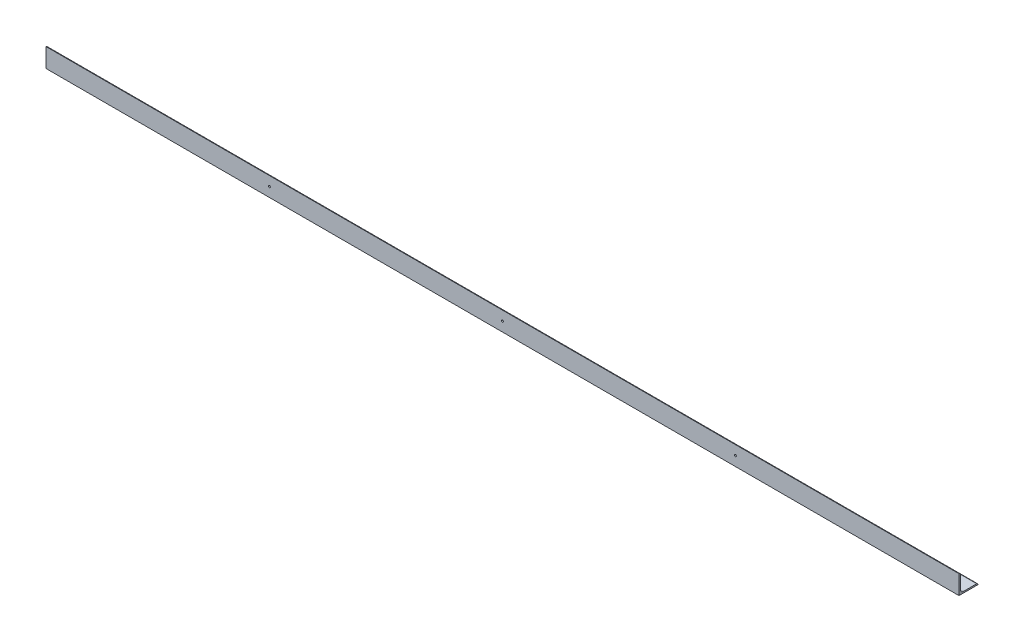
ISO-10303-21;
HEADER;
FILE_DESCRIPTION(('STEP AP214'),'2;1');
FILE_NAME('part.step','',(''),(''),'','','');
FILE_SCHEMA(('AUTOMOTIVE_DESIGN { 1 0 10303 214 1 1 1 1 }'));
ENDSEC;
DATA;
#1=APPLICATION_CONTEXT('core data for automotive mechanical design processes');
#2=APPLICATION_PROTOCOL_DEFINITION('international standard','automotive_design',2000,#1);
#3=PRODUCT_CONTEXT('',#1,'mechanical');
#4=PRODUCT('Part','Part','',(#3));
#5=PRODUCT_RELATED_PRODUCT_CATEGORY('part','',(#4));
#6=PRODUCT_DEFINITION_FORMATION('','',#4);
#7=PRODUCT_DEFINITION_CONTEXT('part definition',#1,'design');
#8=PRODUCT_DEFINITION('design','',#6,#7);
#9=PRODUCT_DEFINITION_SHAPE('','',#8);
#10=(LENGTH_UNIT() NAMED_UNIT(*) SI_UNIT(.MILLI.,.METRE.));
#11=(NAMED_UNIT(*) PLANE_ANGLE_UNIT() SI_UNIT($,.RADIAN.));
#12=(NAMED_UNIT(*) SI_UNIT($,.STERADIAN.) SOLID_ANGLE_UNIT());
#13=UNCERTAINTY_MEASURE_WITH_UNIT(LENGTH_MEASURE(1.E-05),#10,'distance_accuracy_value','');
#14=(GEOMETRIC_REPRESENTATION_CONTEXT(3) GLOBAL_UNCERTAINTY_ASSIGNED_CONTEXT((#13)) GLOBAL_UNIT_ASSIGNED_CONTEXT((#10,
#11,#12)) REPRESENTATION_CONTEXT('',''));
#15=CARTESIAN_POINT('',(0.,0.,0.));
#16=DIRECTION('',(0.,0.,1.));
#17=DIRECTION('',(1.,0.,0.));
#18=AXIS2_PLACEMENT_3D('',#15,#16,#17);
#19=CARTESIAN_POINT('',(1920.,0.,-40.));
#20=DIRECTION('',(0.,1.,0.));
#21=DIRECTION('',(0.,0.,1.));
#22=AXIS2_PLACEMENT_3D('',#19,#20,#21);
#23=PLANE('',#22);
#24=CARTESIAN_POINT('',(1450.,0.,-19.9999999999966));
#25=DIRECTION('',(0.,-1.,0.));
#26=DIRECTION('',(0.,0.,-1.));
#27=AXIS2_PLACEMENT_3D('',#24,#25,#26);
#28=CIRCLE('',#27,1.99999999999989);
#29=CARTESIAN_POINT('',(1450.,0.,-21.9999999999965));
#30=VERTEX_POINT('',#29);
#31=EDGE_CURVE('E235',#30,#30,#28,.T.);
#32=ORIENTED_EDGE('',*,*,#31,.F.);
#33=EDGE_LOOP('',(#32));
#34=FACE_BOUND('',#33,.T.);
#35=CARTESIAN_POINT('',(470.,0.,-20.));
#36=DIRECTION('',(0.,-1.,0.));
#37=DIRECTION('',(0.,0.,-1.));
#38=AXIS2_PLACEMENT_3D('',#35,#36,#37);
#39=CIRCLE('',#38,2.);
#40=CARTESIAN_POINT('',(470.,0.,-22.));
#41=VERTEX_POINT('',#40);
#42=EDGE_CURVE('E239',#41,#41,#39,.T.);
#43=ORIENTED_EDGE('',*,*,#42,.F.);
#44=EDGE_LOOP('',(#43));
#45=FACE_BOUND('',#44,.T.);
#46=CARTESIAN_POINT('',(960.,0.,-20.));
#47=DIRECTION('',(0.,-1.,0.));
#48=DIRECTION('',(0.,0.,-1.));
#49=AXIS2_PLACEMENT_3D('',#46,#47,#48);
#50=CIRCLE('',#49,2.);
#51=CARTESIAN_POINT('',(960.,0.,-22.));
#52=VERTEX_POINT('',#51);
#53=EDGE_CURVE('E198',#52,#52,#50,.T.);
#54=ORIENTED_EDGE('',*,*,#53,.F.);
#55=EDGE_LOOP('',(#54));
#56=FACE_BOUND('',#55,.T.);
#57=DIRECTION('',(0.,0.,-1.));
#58=VECTOR('',#57,1.);
#59=CARTESIAN_POINT('',(0.,0.,-40.));
#60=LINE('',#59,#58);
#61=CARTESIAN_POINT('',(0.,0.,0.));
#62=VERTEX_POINT('',#61);
#63=CARTESIAN_POINT('',(0.,0.,-40.));
#64=VERTEX_POINT('',#63);
#65=EDGE_CURVE('E161',#62,#64,#60,.T.);
#66=ORIENTED_EDGE('',*,*,#65,.T.);
#67=DIRECTION('',(-1.,0.,0.));
#68=VECTOR('',#67,1.);
#69=CARTESIAN_POINT('',(1920.,0.,-40.));
#70=LINE('',#69,#68);
#71=CARTESIAN_POINT('',(1920.,0.,-40.));
#72=VERTEX_POINT('',#71);
#73=EDGE_CURVE('E13',#72,#64,#70,.T.);
#74=ORIENTED_EDGE('',*,*,#73,.F.);
#75=DIRECTION('',(0.,0.,-1.));
#76=VECTOR('',#75,1.);
#77=CARTESIAN_POINT('',(1920.,0.,-40.));
#78=LINE('',#77,#76);
#79=CARTESIAN_POINT('',(1920.,0.,0.));
#80=VERTEX_POINT('',#79);
#81=EDGE_CURVE('E180',#80,#72,#78,.T.);
#82=ORIENTED_EDGE('',*,*,#81,.F.);
#83=DIRECTION('',(-1.,0.,0.));
#84=VECTOR('',#83,1.);
#85=CARTESIAN_POINT('',(1920.,0.,0.));
#86=LINE('',#85,#84);
#87=EDGE_CURVE('E157',#80,#62,#86,.T.);
#88=ORIENTED_EDGE('',*,*,#87,.T.);
#89=EDGE_LOOP('',(#66,#74,#82,#88));
#90=FACE_BOUND('',#89,.T.);
#91=ADVANCED_FACE('F64',(#34,#45,#56,#90),#23,.F.);
#92=CARTESIAN_POINT('',(1920.,0.,-37.));
#93=DIRECTION('',(-1.,0.,0.));
#94=DIRECTION('',(0.,0.,1.));
#95=AXIS2_PLACEMENT_3D('',#92,#93,#94);
#96=CYLINDRICAL_SURFACE('',#95,3.);
#97=CARTESIAN_POINT('',(0.,0.,-37.));
#98=DIRECTION('',(1.,0.,0.));
#99=DIRECTION('',(0.,0.,-1.));
#100=AXIS2_PLACEMENT_3D('',#97,#98,#99);
#101=CIRCLE('',#100,3.);
#102=CARTESIAN_POINT('',(0.,3.,-37.));
#103=VERTEX_POINT('',#102);
#104=EDGE_CURVE('E165',#64,#103,#101,.T.);
#105=ORIENTED_EDGE('',*,*,#104,.T.);
#106=DIRECTION('',(-1.,0.,0.));
#107=VECTOR('',#106,1.);
#108=CARTESIAN_POINT('',(1920.,3.,-37.));
#109=LINE('',#108,#107);
#110=CARTESIAN_POINT('',(1920.,3.,-37.));
#111=VERTEX_POINT('',#110);
#112=EDGE_CURVE('E74',#111,#103,#109,.T.);
#113=ORIENTED_EDGE('',*,*,#112,.F.);
#114=CARTESIAN_POINT('',(1920.,0.,-37.));
#115=DIRECTION('',(1.,0.,0.));
#116=DIRECTION('',(0.,0.,-1.));
#117=AXIS2_PLACEMENT_3D('',#114,#115,#116);
#118=CIRCLE('',#117,3.);
#119=EDGE_CURVE('E123',#72,#111,#118,.T.);
#120=ORIENTED_EDGE('',*,*,#119,.F.);
#121=ORIENTED_EDGE('',*,*,#73,.T.);
#122=EDGE_LOOP('',(#105,#113,#120,#121));
#123=FACE_BOUND('',#122,.T.);
#124=ADVANCED_FACE('F228',(#123),#96,.T.);
#125=CARTESIAN_POINT('',(1920.,3.,-9.));
#126=DIRECTION('',(0.,-1.,0.));
#127=DIRECTION('',(0.,0.,-1.));
#128=AXIS2_PLACEMENT_3D('',#125,#126,#127);
#129=PLANE('',#128);
#130=CARTESIAN_POINT('',(1450.,3.,-19.9999999999966));
#131=DIRECTION('',(0.,-1.,0.));
#132=DIRECTION('',(0.,0.,-1.));
#133=AXIS2_PLACEMENT_3D('',#130,#131,#132);
#134=CIRCLE('',#133,1.99999999999989);
#135=CARTESIAN_POINT('',(1450.,3.,-21.9999999999965));
#136=VERTEX_POINT('',#135);
#137=EDGE_CURVE('E67',#136,#136,#134,.T.);
#138=ORIENTED_EDGE('',*,*,#137,.T.);
#139=EDGE_LOOP('',(#138));
#140=FACE_BOUND('',#139,.T.);
#141=CARTESIAN_POINT('',(470.,3.,-20.));
#142=DIRECTION('',(0.,-1.,0.));
#143=DIRECTION('',(0.,0.,-1.));
#144=AXIS2_PLACEMENT_3D('',#141,#142,#143);
#145=CIRCLE('',#144,2.);
#146=CARTESIAN_POINT('',(470.,3.,-22.));
#147=VERTEX_POINT('',#146);
#148=EDGE_CURVE('E197',#147,#147,#145,.T.);
#149=ORIENTED_EDGE('',*,*,#148,.T.);
#150=EDGE_LOOP('',(#149));
#151=FACE_BOUND('',#150,.T.);
#152=CARTESIAN_POINT('',(960.,3.,-20.));
#153=DIRECTION('',(0.,-1.,0.));
#154=DIRECTION('',(0.,0.,-1.));
#155=AXIS2_PLACEMENT_3D('',#152,#153,#154);
#156=CIRCLE('',#155,2.);
#157=CARTESIAN_POINT('',(960.,3.,-22.));
#158=VERTEX_POINT('',#157);
#159=EDGE_CURVE('E194',#158,#158,#156,.T.);
#160=ORIENTED_EDGE('',*,*,#159,.T.);
#161=EDGE_LOOP('',(#160));
#162=FACE_BOUND('',#161,.T.);
#163=DIRECTION('',(0.,0.,1.));
#164=VECTOR('',#163,1.);
#165=CARTESIAN_POINT('',(0.,3.,-9.));
#166=LINE('',#165,#164);
#167=CARTESIAN_POINT('',(0.,3.,-9.00000000000001));
#168=VERTEX_POINT('',#167);
#169=EDGE_CURVE('E168',#103,#168,#166,.T.);
#170=ORIENTED_EDGE('',*,*,#169,.T.);
#171=DIRECTION('',(-1.,0.,0.));
#172=VECTOR('',#171,1.);
#173=CARTESIAN_POINT('',(1920.,3.,-9.00000000000001));
#174=LINE('',#173,#172);
#175=CARTESIAN_POINT('',(1920.,3.,-9.00000000000001));
#176=VERTEX_POINT('',#175);
#177=EDGE_CURVE('E187',#176,#168,#174,.T.);
#178=ORIENTED_EDGE('',*,*,#177,.F.);
#179=DIRECTION('',(0.,0.,1.));
#180=VECTOR('',#179,1.);
#181=CARTESIAN_POINT('',(1920.,3.,-9.));
#182=LINE('',#181,#180);
#183=EDGE_CURVE('E253',#111,#176,#182,.T.);
#184=ORIENTED_EDGE('',*,*,#183,.F.);
#185=ORIENTED_EDGE('',*,*,#112,.T.);
#186=EDGE_LOOP('',(#170,#178,#184,#185));
#187=FACE_BOUND('',#186,.T.);
#188=ADVANCED_FACE('F207',(#140,#151,#162,#187),#129,.F.);
#189=CARTESIAN_POINT('',(1920.,9.,-9.));
#190=DIRECTION('',(-1.,0.,0.));
#191=DIRECTION('',(0.,0.,1.));
#192=AXIS2_PLACEMENT_3D('',#189,#190,#191);
#193=CYLINDRICAL_SURFACE('',#192,6.);
#194=CARTESIAN_POINT('',(0.,9.,-9.));
#195=DIRECTION('',(-1.,0.,0.));
#196=DIRECTION('',(0.,0.,1.));
#197=AXIS2_PLACEMENT_3D('',#194,#195,#196);
#198=CIRCLE('',#197,6.);
#199=CARTESIAN_POINT('',(0.,9.,-3.));
#200=VERTEX_POINT('',#199);
#201=EDGE_CURVE('E171',#168,#200,#198,.T.);
#202=ORIENTED_EDGE('',*,*,#201,.T.);
#203=DIRECTION('',(-1.,0.,0.));
#204=VECTOR('',#203,1.);
#205=CARTESIAN_POINT('',(1920.,9.,-3.));
#206=LINE('',#205,#204);
#207=CARTESIAN_POINT('',(1920.,9.,-3.));
#208=VERTEX_POINT('',#207);
#209=EDGE_CURVE('E150',#208,#200,#206,.T.);
#210=ORIENTED_EDGE('',*,*,#209,.F.);
#211=CARTESIAN_POINT('',(1920.,9.,-9.));
#212=DIRECTION('',(-1.,0.,0.));
#213=DIRECTION('',(0.,0.,1.));
#214=AXIS2_PLACEMENT_3D('',#211,#212,#213);
#215=CIRCLE('',#214,6.);
#216=EDGE_CURVE('E139',#176,#208,#215,.T.);
#217=ORIENTED_EDGE('',*,*,#216,.F.);
#218=ORIENTED_EDGE('',*,*,#177,.T.);
#219=EDGE_LOOP('',(#202,#210,#217,#218));
#220=FACE_BOUND('',#219,.T.);
#221=ADVANCED_FACE('F320',(#220),#193,.F.);
#222=CARTESIAN_POINT('',(1920.,37.,-3.));
#223=DIRECTION('',(0.,0.,1.));
#224=DIRECTION('',(1.,0.,0.));
#225=AXIS2_PLACEMENT_3D('',#222,#223,#224);
#226=PLANE('',#225);
#227=CARTESIAN_POINT('',(470.,20.0000000000001,-3.));
#228=DIRECTION('',(0.,0.,1.));
#229=DIRECTION('',(1.,0.,0.));
#230=AXIS2_PLACEMENT_3D('',#227,#228,#229);
#231=CIRCLE('',#230,2.);
#232=CARTESIAN_POINT('',(472.,20.0000000000001,-3.));
#233=VERTEX_POINT('',#232);
#234=EDGE_CURVE('E281',#233,#233,#231,.T.);
#235=ORIENTED_EDGE('',*,*,#234,.T.);
#236=EDGE_LOOP('',(#235));
#237=FACE_BOUND('',#236,.T.);
#238=CARTESIAN_POINT('',(1450.,20.,-3.));
#239=DIRECTION('',(0.,0.,1.));
#240=DIRECTION('',(1.,0.,0.));
#241=AXIS2_PLACEMENT_3D('',#238,#239,#240);
#242=CIRCLE('',#241,1.99999999999987);
#243=CARTESIAN_POINT('',(1452.,20.,-3.));
#244=VERTEX_POINT('',#243);
#245=EDGE_CURVE('E273',#244,#244,#242,.T.);
#246=ORIENTED_EDGE('',*,*,#245,.T.);
#247=EDGE_LOOP('',(#246));
#248=FACE_BOUND('',#247,.T.);
#249=CARTESIAN_POINT('',(960.,20.,-3.));
#250=DIRECTION('',(0.,0.,1.));
#251=DIRECTION('',(1.,0.,0.));
#252=AXIS2_PLACEMENT_3D('',#249,#250,#251);
#253=CIRCLE('',#252,2.);
#254=CARTESIAN_POINT('',(962.,20.,-3.));
#255=VERTEX_POINT('',#254);
#256=EDGE_CURVE('E266',#255,#255,#253,.T.);
#257=ORIENTED_EDGE('',*,*,#256,.T.);
#258=EDGE_LOOP('',(#257));
#259=FACE_BOUND('',#258,.T.);
#260=DIRECTION('',(0.,1.,0.));
#261=VECTOR('',#260,1.);
#262=CARTESIAN_POINT('',(0.,37.,-3.));
#263=LINE('',#262,#261);
#264=CARTESIAN_POINT('',(0.,37.,-3.));
#265=VERTEX_POINT('',#264);
#266=EDGE_CURVE('E148',#200,#265,#263,.T.);
#267=ORIENTED_EDGE('',*,*,#266,.T.);
#268=DIRECTION('',(-1.,0.,0.));
#269=VECTOR('',#268,1.);
#270=CARTESIAN_POINT('',(1920.,37.,-3.));
#271=LINE('',#270,#269);
#272=CARTESIAN_POINT('',(1920.,37.,-3.));
#273=VERTEX_POINT('',#272);
#274=EDGE_CURVE('E145',#273,#265,#271,.T.);
#275=ORIENTED_EDGE('',*,*,#274,.F.);
#276=DIRECTION('',(0.,1.,0.));
#277=VECTOR('',#276,1.);
#278=CARTESIAN_POINT('',(1920.,37.,-3.));
#279=LINE('',#278,#277);
#280=EDGE_CURVE('E133',#208,#273,#279,.T.);
#281=ORIENTED_EDGE('',*,*,#280,.F.);
#282=ORIENTED_EDGE('',*,*,#209,.T.);
#283=EDGE_LOOP('',(#267,#275,#281,#282));
#284=FACE_BOUND('',#283,.T.);
#285=ADVANCED_FACE('F146',(#237,#248,#259,#284),#226,.F.);
#286=CARTESIAN_POINT('',(1920.,37.,0.));
#287=DIRECTION('',(-1.,0.,0.));
#288=DIRECTION('',(0.,0.,1.));
#289=AXIS2_PLACEMENT_3D('',#286,#287,#288);
#290=CYLINDRICAL_SURFACE('',#289,3.);
#291=CARTESIAN_POINT('',(0.,37.,0.));
#292=DIRECTION('',(1.,0.,0.));
#293=DIRECTION('',(0.,0.,-1.));
#294=AXIS2_PLACEMENT_3D('',#291,#292,#293);
#295=CIRCLE('',#294,3.);
#296=CARTESIAN_POINT('',(0.,40.,0.));
#297=VERTEX_POINT('',#296);
#298=EDGE_CURVE('E109',#265,#297,#295,.T.);
#299=ORIENTED_EDGE('',*,*,#298,.T.);
#300=DIRECTION('',(-1.,0.,0.));
#301=VECTOR('',#300,1.);
#302=CARTESIAN_POINT('',(1920.,40.,0.));
#303=LINE('',#302,#301);
#304=CARTESIAN_POINT('',(1920.,40.,0.));
#305=VERTEX_POINT('',#304);
#306=EDGE_CURVE('E151',#305,#297,#303,.T.);
#307=ORIENTED_EDGE('',*,*,#306,.F.);
#308=CARTESIAN_POINT('',(1920.,37.,0.));
#309=DIRECTION('',(1.,0.,0.));
#310=DIRECTION('',(0.,0.,-1.));
#311=AXIS2_PLACEMENT_3D('',#308,#309,#310);
#312=CIRCLE('',#311,3.);
#313=EDGE_CURVE('E137',#273,#305,#312,.T.);
#314=ORIENTED_EDGE('',*,*,#313,.F.);
#315=ORIENTED_EDGE('',*,*,#274,.T.);
#316=EDGE_LOOP('',(#299,#307,#314,#315));
#317=FACE_BOUND('',#316,.T.);
#318=ADVANCED_FACE('F153',(#317),#290,.T.);
#319=CARTESIAN_POINT('',(1920.,40.,0.));
#320=DIRECTION('',(0.,0.,-1.));
#321=DIRECTION('',(-1.,0.,0.));
#322=AXIS2_PLACEMENT_3D('',#319,#320,#321);
#323=PLANE('',#322);
#324=CARTESIAN_POINT('',(470.,20.0000000000001,0.));
#325=DIRECTION('',(0.,0.,1.));
#326=DIRECTION('',(1.,0.,0.));
#327=AXIS2_PLACEMENT_3D('',#324,#325,#326);
#328=CIRCLE('',#327,2.);
#329=CARTESIAN_POINT('',(472.,20.0000000000001,0.));
#330=VERTEX_POINT('',#329);
#331=EDGE_CURVE('E277',#330,#330,#328,.T.);
#332=ORIENTED_EDGE('',*,*,#331,.F.);
#333=EDGE_LOOP('',(#332));
#334=FACE_BOUND('',#333,.T.);
#335=CARTESIAN_POINT('',(1450.,20.,0.));
#336=DIRECTION('',(0.,0.,1.));
#337=DIRECTION('',(1.,0.,0.));
#338=AXIS2_PLACEMENT_3D('',#335,#336,#337);
#339=CIRCLE('',#338,1.99999999999987);
#340=CARTESIAN_POINT('',(1452.,20.,0.));
#341=VERTEX_POINT('',#340);
#342=EDGE_CURVE('E285',#341,#341,#339,.T.);
#343=ORIENTED_EDGE('',*,*,#342,.F.);
#344=EDGE_LOOP('',(#343));
#345=FACE_BOUND('',#344,.T.);
#346=CARTESIAN_POINT('',(960.,20.,0.));
#347=DIRECTION('',(0.,0.,1.));
#348=DIRECTION('',(1.,0.,0.));
#349=AXIS2_PLACEMENT_3D('',#346,#347,#348);
#350=CIRCLE('',#349,2.);
#351=CARTESIAN_POINT('',(962.,20.,0.));
#352=VERTEX_POINT('',#351);
#353=EDGE_CURVE('E269',#352,#352,#350,.T.);
#354=ORIENTED_EDGE('',*,*,#353,.F.);
#355=EDGE_LOOP('',(#354));
#356=FACE_BOUND('',#355,.T.);
#357=DIRECTION('',(0.,-1.,0.));
#358=VECTOR('',#357,1.);
#359=CARTESIAN_POINT('',(0.,40.,0.));
#360=LINE('',#359,#358);
#361=EDGE_CURVE('E115',#297,#62,#360,.T.);
#362=ORIENTED_EDGE('',*,*,#361,.T.);
#363=ORIENTED_EDGE('',*,*,#87,.F.);
#364=DIRECTION('',(0.,-1.,0.));
#365=VECTOR('',#364,1.);
#366=CARTESIAN_POINT('',(1920.,40.,0.));
#367=LINE('',#366,#365);
#368=EDGE_CURVE('E83',#305,#80,#367,.T.);
#369=ORIENTED_EDGE('',*,*,#368,.F.);
#370=ORIENTED_EDGE('',*,*,#306,.T.);
#371=EDGE_LOOP('',(#362,#363,#369,#370));
#372=FACE_BOUND('',#371,.T.);
#373=ADVANCED_FACE('F301',(#334,#345,#356,#372),#323,.F.);
#374=CARTESIAN_POINT('',(1920.,37.,0.));
#375=DIRECTION('',(1.,0.,0.));
#376=DIRECTION('',(0.,0.,-1.));
#377=AXIS2_PLACEMENT_3D('',#374,#375,#376);
#378=PLANE('',#377);
#379=ORIENTED_EDGE('',*,*,#81,.T.);
#380=ORIENTED_EDGE('',*,*,#119,.T.);
#381=ORIENTED_EDGE('',*,*,#183,.T.);
#382=ORIENTED_EDGE('',*,*,#216,.T.);
#383=ORIENTED_EDGE('',*,*,#280,.T.);
#384=ORIENTED_EDGE('',*,*,#313,.T.);
#385=ORIENTED_EDGE('',*,*,#368,.T.);
#386=EDGE_LOOP('',(#379,#380,#381,#382,#383,#384,#385));
#387=FACE_BOUND('',#386,.T.);
#388=ADVANCED_FACE('F135',(#387),#378,.T.);
#389=CARTESIAN_POINT('',(0.,37.,0.));
#390=DIRECTION('',(1.,0.,0.));
#391=DIRECTION('',(0.,0.,-1.));
#392=AXIS2_PLACEMENT_3D('',#389,#390,#391);
#393=PLANE('',#392);
#394=ORIENTED_EDGE('',*,*,#65,.F.);
#395=ORIENTED_EDGE('',*,*,#361,.F.);
#396=ORIENTED_EDGE('',*,*,#298,.F.);
#397=ORIENTED_EDGE('',*,*,#266,.F.);
#398=ORIENTED_EDGE('',*,*,#201,.F.);
#399=ORIENTED_EDGE('',*,*,#169,.F.);
#400=ORIENTED_EDGE('',*,*,#104,.F.);
#401=EDGE_LOOP('',(#394,#395,#396,#397,#398,#399,#400));
#402=FACE_BOUND('',#401,.T.);
#403=ADVANCED_FACE('F247',(#402),#393,.F.);
#404=CARTESIAN_POINT('',(960.,10.,-20.));
#405=DIRECTION('',(0.,-1.,0.));
#406=DIRECTION('',(0.,0.,-1.));
#407=AXIS2_PLACEMENT_3D('',#404,#405,#406);
#408=CYLINDRICAL_SURFACE('',#407,2.);
#409=ORIENTED_EDGE('',*,*,#53,.T.);
#410=EDGE_LOOP('',(#409));
#411=FACE_BOUND('',#410,.T.);
#412=ORIENTED_EDGE('',*,*,#159,.F.);
#413=EDGE_LOOP('',(#412));
#414=FACE_BOUND('',#413,.T.);
#415=ADVANCED_FACE('F222',(#411,#414),#408,.F.);
#416=CARTESIAN_POINT('',(470.,10.,-20.));
#417=DIRECTION('',(0.,-1.,0.));
#418=DIRECTION('',(0.,0.,-1.));
#419=AXIS2_PLACEMENT_3D('',#416,#417,#418);
#420=CYLINDRICAL_SURFACE('',#419,2.);
#421=ORIENTED_EDGE('',*,*,#42,.T.);
#422=EDGE_LOOP('',(#421));
#423=FACE_BOUND('',#422,.T.);
#424=ORIENTED_EDGE('',*,*,#148,.F.);
#425=EDGE_LOOP('',(#424));
#426=FACE_BOUND('',#425,.T.);
#427=ADVANCED_FACE('F212',(#423,#426),#420,.F.);
#428=CARTESIAN_POINT('',(1450.,10.,-19.9999999999966));
#429=DIRECTION('',(0.,-1.,0.));
#430=DIRECTION('',(0.,0.,-1.));
#431=AXIS2_PLACEMENT_3D('',#428,#429,#430);
#432=CYLINDRICAL_SURFACE('',#431,1.99999999999989);
#433=ORIENTED_EDGE('',*,*,#31,.T.);
#434=EDGE_LOOP('',(#433));
#435=FACE_BOUND('',#434,.T.);
#436=ORIENTED_EDGE('',*,*,#137,.F.);
#437=EDGE_LOOP('',(#436));
#438=FACE_BOUND('',#437,.T.);
#439=ADVANCED_FACE('F209',(#435,#438),#432,.F.);
#440=CARTESIAN_POINT('',(960.,20.,-3.));
#441=DIRECTION('',(0.,0.,1.));
#442=DIRECTION('',(1.,0.,0.));
#443=AXIS2_PLACEMENT_3D('',#440,#441,#442);
#444=CYLINDRICAL_SURFACE('',#443,2.);
#445=ORIENTED_EDGE('',*,*,#256,.F.);
#446=EDGE_LOOP('',(#445));
#447=FACE_BOUND('',#446,.T.);
#448=ORIENTED_EDGE('',*,*,#353,.T.);
#449=EDGE_LOOP('',(#448));
#450=FACE_BOUND('',#449,.T.);
#451=ADVANCED_FACE('F211',(#447,#450),#444,.F.);
#452=CARTESIAN_POINT('',(1450.,20.,-3.));
#453=DIRECTION('',(0.,0.,1.));
#454=DIRECTION('',(1.,0.,0.));
#455=AXIS2_PLACEMENT_3D('',#452,#453,#454);
#456=CYLINDRICAL_SURFACE('',#455,1.99999999999987);
#457=ORIENTED_EDGE('',*,*,#245,.F.);
#458=EDGE_LOOP('',(#457));
#459=FACE_BOUND('',#458,.T.);
#460=ORIENTED_EDGE('',*,*,#342,.T.);
#461=EDGE_LOOP('',(#460));
#462=FACE_BOUND('',#461,.T.);
#463=ADVANCED_FACE('F219',(#459,#462),#456,.F.);
#464=CARTESIAN_POINT('',(470.,20.0000000000001,-3.));
#465=DIRECTION('',(0.,0.,1.));
#466=DIRECTION('',(1.,0.,0.));
#467=AXIS2_PLACEMENT_3D('',#464,#465,#466);
#468=CYLINDRICAL_SURFACE('',#467,2.);
#469=ORIENTED_EDGE('',*,*,#234,.F.);
#470=EDGE_LOOP('',(#469));
#471=FACE_BOUND('',#470,.T.);
#472=ORIENTED_EDGE('',*,*,#331,.T.);
#473=EDGE_LOOP('',(#472));
#474=FACE_BOUND('',#473,.T.);
#475=ADVANCED_FACE('F297',(#471,#474),#468,.F.);
#476=CLOSED_SHELL('',(#91,#124,#188,#221,#285,#318,#373,#388,#403,#415,#427,#439,#451,#463,#475));
#477=MANIFOLD_SOLID_BREP('B2',#476);
#478=ADVANCED_BREP_SHAPE_REPRESENTATION('',(#18,#477),#14);
#479=SHAPE_DEFINITION_REPRESENTATION(#9,#478);
ENDSEC;
END-ISO-10303-21;
